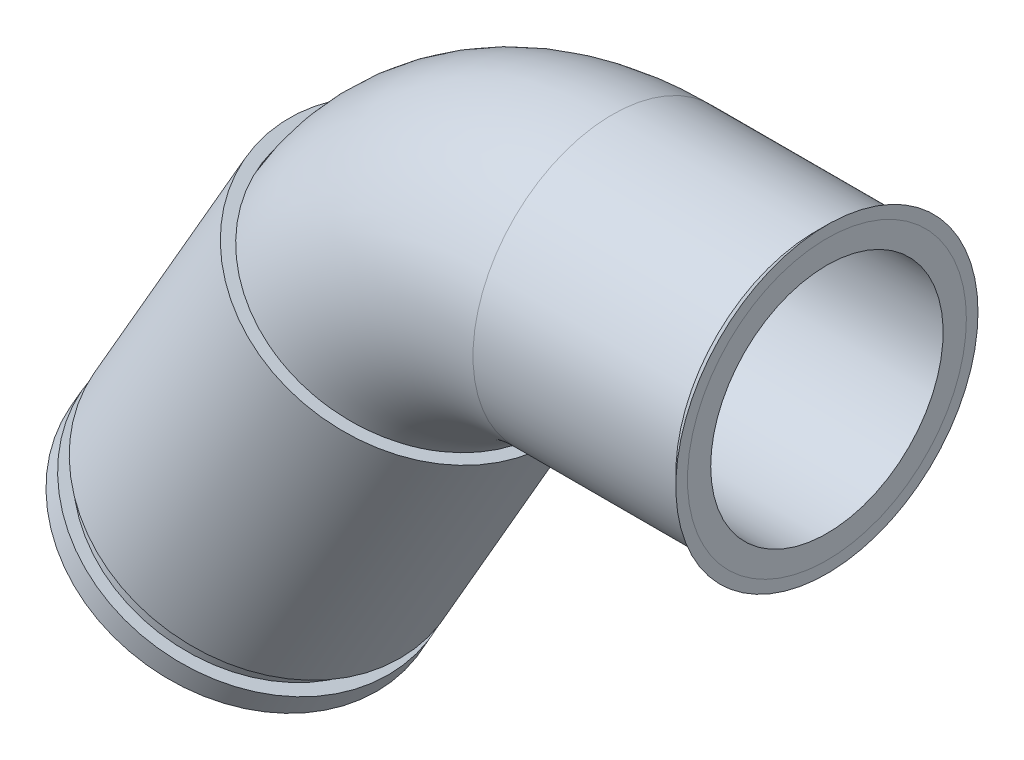
ISO-10303-21;
HEADER;
FILE_DESCRIPTION(('STEP AP214'),'2;1');
FILE_NAME('part.step','',(''),(''),'','','');
FILE_SCHEMA(('AUTOMOTIVE_DESIGN { 1 0 10303 214 1 1 1 1 }'));
ENDSEC;
DATA;
#1=APPLICATION_CONTEXT('core data for automotive mechanical design processes');
#2=APPLICATION_PROTOCOL_DEFINITION('international standard','automotive_design',2000,#1);
#3=PRODUCT_CONTEXT('',#1,'mechanical');
#4=PRODUCT('Part','Part','',(#3));
#5=PRODUCT_RELATED_PRODUCT_CATEGORY('part','',(#4));
#6=PRODUCT_DEFINITION_FORMATION('','',#4);
#7=PRODUCT_DEFINITION_CONTEXT('part definition',#1,'design');
#8=PRODUCT_DEFINITION('design','',#6,#7);
#9=PRODUCT_DEFINITION_SHAPE('','',#8);
#10=(LENGTH_UNIT() NAMED_UNIT(*) SI_UNIT(.MILLI.,.METRE.));
#11=(NAMED_UNIT(*) PLANE_ANGLE_UNIT() SI_UNIT($,.RADIAN.));
#12=(NAMED_UNIT(*) SI_UNIT($,.STERADIAN.) SOLID_ANGLE_UNIT());
#13=UNCERTAINTY_MEASURE_WITH_UNIT(LENGTH_MEASURE(1.E-05),#10,'distance_accuracy_value','');
#14=(GEOMETRIC_REPRESENTATION_CONTEXT(3) GLOBAL_UNCERTAINTY_ASSIGNED_CONTEXT((#13)) GLOBAL_UNIT_ASSIGNED_CONTEXT((#10,
#11,#12)) REPRESENTATION_CONTEXT('',''));
#15=CARTESIAN_POINT('',(0.,0.,0.));
#16=DIRECTION('',(0.,0.,1.));
#17=DIRECTION('',(1.,0.,0.));
#18=AXIS2_PLACEMENT_3D('',#15,#16,#17);
#19=CARTESIAN_POINT('',(15.,0.,0.));
#20=DIRECTION('',(1.,0.,0.));
#21=DIRECTION('',(0.,0.,-1.));
#22=AXIS2_PLACEMENT_3D('',#19,#20,#21);
#23=PLANE('',#22);
#24=CARTESIAN_POINT('',(15.,0.,0.));
#25=DIRECTION('',(1.,0.,0.));
#26=DIRECTION('',(0.,0.,-1.));
#27=AXIS2_PLACEMENT_3D('',#24,#25,#26);
#28=CIRCLE('',#27,6.);
#29=CARTESIAN_POINT('',(15.,0.,-6.));
#30=VERTEX_POINT('',#29);
#31=EDGE_CURVE('E79',#30,#30,#28,.T.);
#32=ORIENTED_EDGE('',*,*,#31,.F.);
#33=EDGE_LOOP('',(#32));
#34=FACE_BOUND('',#33,.T.);
#35=CARTESIAN_POINT('',(15.,0.,0.));
#36=DIRECTION('',(1.,0.,0.));
#37=DIRECTION('',(0.,0.,-1.));
#38=AXIS2_PLACEMENT_3D('',#35,#36,#37);
#39=CIRCLE('',#38,6.5);
#40=CARTESIAN_POINT('',(15.,0.,-6.5));
#41=VERTEX_POINT('',#40);
#42=EDGE_CURVE('E75',#41,#41,#39,.T.);
#43=ORIENTED_EDGE('',*,*,#42,.T.);
#44=EDGE_LOOP('',(#43));
#45=FACE_BOUND('',#44,.T.);
#46=ADVANCED_FACE('F67',(#34,#45),#23,.T.);
#47=CARTESIAN_POINT('',(14.,0.,0.));
#48=DIRECTION('',(1.,0.,0.));
#49=DIRECTION('',(0.,0.,-1.));
#50=AXIS2_PLACEMENT_3D('',#47,#48,#49);
#51=CYLINDRICAL_SURFACE('',#50,6.);
#52=CARTESIAN_POINT('',(14.5,0.,0.));
#53=DIRECTION('',(1.,0.,0.));
#54=DIRECTION('',(0.,0.,-1.));
#55=AXIS2_PLACEMENT_3D('',#52,#53,#54);
#56=CIRCLE('',#55,6.);
#57=CARTESIAN_POINT('',(14.5,0.,-6.));
#58=VERTEX_POINT('',#57);
#59=EDGE_CURVE('E12',#58,#58,#56,.F.);
#60=ORIENTED_EDGE('',*,*,#59,.T.);
#61=EDGE_LOOP('',(#60));
#62=FACE_BOUND('',#61,.T.);
#63=ORIENTED_EDGE('',*,*,#31,.T.);
#64=EDGE_LOOP('',(#63));
#65=FACE_BOUND('',#64,.T.);
#66=ADVANCED_FACE('F86',(#62,#65),#51,.F.);
#67=CARTESIAN_POINT('',(15.,0.,0.));
#68=DIRECTION('',(1.,0.,0.));
#69=DIRECTION('',(0.,0.,-1.));
#70=AXIS2_PLACEMENT_3D('',#67,#68,#69);
#71=CONICAL_SURFACE('',#70,6.5,0.785398163397443);
#72=ORIENTED_EDGE('',*,*,#59,.F.);
#73=EDGE_LOOP('',(#72));
#74=FACE_BOUND('',#73,.T.);
#75=ORIENTED_EDGE('',*,*,#42,.F.);
#76=EDGE_LOOP('',(#75));
#77=FACE_BOUND('',#76,.T.);
#78=ADVANCED_FACE('F70',(#74,#77),#71,.T.);
#79=CLOSED_SHELL('',(#46,#66,#78));
#80=MANIFOLD_SOLID_BREP('B2',#79);
#81=CARTESIAN_POINT('',(-2.50000000000003,-4.3301270189222,0.));
#82=DIRECTION('',(-0.500000000000004,-0.866025403784436,0.));
#83=DIRECTION('',(0.866025403784436,-0.500000000000004,0.));
#84=AXIS2_PLACEMENT_3D('',#81,#82,#83);
#85=CYLINDRICAL_SURFACE('',#84,6.5);
#86=CARTESIAN_POINT('',(-2.50000000000003,-4.3301270189222,0.));
#87=DIRECTION('',(-0.500000000000004,-0.866025403784436,0.));
#88=DIRECTION('',(0.866025403784436,-0.500000000000004,0.));
#89=AXIS2_PLACEMENT_3D('',#86,#87,#88);
#90=CIRCLE('',#89,6.5);
#91=CARTESIAN_POINT('',(3.12916512459881,-7.58012701892223,0.));
#92=VERTEX_POINT('',#91);
#93=EDGE_CURVE('E155',#92,#92,#90,.T.);
#94=ORIENTED_EDGE('',*,*,#93,.T.);
#95=EDGE_LOOP('',(#94));
#96=FACE_BOUND('',#95,.T.);
#97=CARTESIAN_POINT('',(-9.00000000000008,-15.5884572681199,0.));
#98=DIRECTION('',(-0.500000000000004,-0.866025403784436,0.));
#99=DIRECTION('',(0.866025403784436,-0.500000000000004,0.));
#100=AXIS2_PLACEMENT_3D('',#97,#98,#99);
#101=CIRCLE('',#100,6.5);
#102=CARTESIAN_POINT('',(-3.37083487540125,-18.8384572681199,0.));
#103=VERTEX_POINT('',#102);
#104=EDGE_CURVE('E162',#103,#103,#101,.T.);
#105=ORIENTED_EDGE('',*,*,#104,.F.);
#106=EDGE_LOOP('',(#105));
#107=FACE_BOUND('',#106,.T.);
#108=ADVANCED_FACE('F117',(#96,#107),#85,.T.);
#109=CARTESIAN_POINT('',(5.77350269189623,-10.,0.));
#110=DIRECTION('',(0.,0.,-1.));
#111=DIRECTION('',(-1.,0.,0.));
#112=AXIS2_PLACEMENT_3D('',#109,#110,#111);
#113=TOROIDAL_SURFACE('',#112,10.,6.);
#114=CARTESIAN_POINT('',(5.77350269189623,0.,0.));
#115=DIRECTION('',(-1.,0.,0.));
#116=DIRECTION('',(0.,-1.,0.));
#117=AXIS2_PLACEMENT_3D('',#114,#115,#116);
#118=CIRCLE('',#117,6.);
#119=CARTESIAN_POINT('',(5.77350269189623,0.,-6.));
#120=VERTEX_POINT('',#119);
#121=EDGE_CURVE('E180',#120,#120,#118,.T.);
#122=ORIENTED_EDGE('',*,*,#121,.T.);
#123=EDGE_LOOP('',(#122));
#124=FACE_BOUND('',#123,.T.);
#125=CARTESIAN_POINT('',(-2.88675134594813,-4.99999999999996,-6.));
#126=CARTESIAN_POINT('',(-2.8631808011482,-4.95917462096695,-5.99999999570752));
#127=CARTESIAN_POINT('',(-2.83946609912723,-4.91843289906037,-6.00000000936942));
#128=CARTESIAN_POINT('',(-2.80188648421198,-4.85439314370545,-5.99999996179683));
#129=CARTESIAN_POINT('',(-2.78811777082677,-4.8310386684738,-5.99999992991882));
#130=CARTESIAN_POINT('',(-2.71903517418746,-4.71440351637093,-5.99999963918576));
#131=CARTESIAN_POINT('',(-2.6630092916258,-4.62154321228815,-5.99999898629731));
#132=CARTESIAN_POINT('',(-2.54090922099794,-4.42283633429401,-5.99999106284579));
#133=CARTESIAN_POINT('',(-2.47459194491508,-4.31713903484471,-5.99998281093962));
#134=CARTESIAN_POINT('',(-2.35681299153588,-4.13325412697252,-5.99994699562532));
#135=CARTESIAN_POINT('',(-2.30577957723011,-4.05479148498118,-5.99992477241994));
#136=CARTESIAN_POINT('',(-2.15099356495191,-3.82040950065842,-5.99982372391699));
#137=CARTESIAN_POINT('',(-2.04559994220693,-3.6655681528269,-5.99971050873934));
#138=CARTESIAN_POINT('',(-1.83055780262435,-3.35887665683654,-5.99928360536966));
#139=CARTESIAN_POINT('',(-1.72090922783883,-3.20702654945769,-5.99896991444647));
#140=CARTESIAN_POINT('',(-1.38449380533269,-2.75440427923701,-5.99751416918022));
#141=CARTESIAN_POINT('',(-1.15140371915382,-2.45829504734502,-5.99585525238656));
#142=CARTESIAN_POINT('',(-0.669521615628209,-1.87908890783363,-5.98954679581689));
#143=CARTESIAN_POINT('',(-0.420725691587182,-1.59599526823846,-5.98489650929841));
#144=CARTESIAN_POINT('',(0.0921013138987495,-1.04242651686981,-5.97041922467504));
#145=CARTESIAN_POINT('',(0.356177964494672,-0.771994012074279,-5.9605759483382));
#146=CARTESIAN_POINT('',(0.897448078039649,-0.245000662273623,-5.93306202036012));
#147=CARTESIAN_POINT('',(1.17464201420304,0.0115596815680788,-5.91539108613862));
#148=CARTESIAN_POINT('',(1.82214771609309,0.582527954135764,-5.86252500931495));
#149=CARTESIAN_POINT('',(2.19627681407395,0.892303646627783,-5.82374759689726));
#150=CARTESIAN_POINT('',(2.96003842407751,1.48833688182889,-5.72065355036783));
#151=CARTESIAN_POINT('',(3.349680280821,1.77457992055313,-5.65632130626715));
#152=CARTESIAN_POINT('',(3.9405303480068,2.18493750405728,-5.53434330632105));
#153=CARTESIAN_POINT('',(4.1380668534126,2.31826038738297,-5.4895740671815));
#154=CARTESIAN_POINT('',(4.53473836870204,2.57874945340555,-5.39033693410184));
#155=CARTESIAN_POINT('',(4.73387308193946,2.70591674918954,-5.33587080200265));
#156=CARTESIAN_POINT('',(5.13253791709789,2.95380714910176,-5.21601039741042));
#157=CARTESIAN_POINT('',(5.3320673073196,3.07453759367987,-5.1506289401241));
#158=CARTESIAN_POINT('',(5.73048853174725,3.30946717691898,-5.0075047967128));
#159=CARTESIAN_POINT('',(5.92938055666491,3.42366848390971,-4.92976624718917));
#160=CARTESIAN_POINT('',(6.27475671097497,3.61710122452249,-4.78193036949276));
#161=CARTESIAN_POINT('',(6.42171412899385,3.69784406698291,-4.71491187241041));
#162=CARTESIAN_POINT('',(6.71367183969133,3.85537769793682,-4.57248279443232));
#163=CARTESIAN_POINT('',(6.85867229941266,3.93216882533643,-4.49707293495479));
#164=CARTESIAN_POINT('',(7.14597880862617,4.08168855700573,-4.3370636774881));
#165=CARTESIAN_POINT('',(7.28828122671474,4.15441191189812,-4.25245280203838));
#166=CARTESIAN_POINT('',(7.56887990156091,4.29542609545569,-4.07340960178174));
#167=CARTESIAN_POINT('',(7.70717611848826,4.36371688005995,-3.97897717937032));
#168=CARTESIAN_POINT('',(7.9799270654506,4.49627256419704,-3.77847146016366));
#169=CARTESIAN_POINT('',(8.11432096312279,4.56048343946674,-3.67227900121301));
#170=CARTESIAN_POINT('',(8.37592458809749,4.68360090558728,-3.44847117353574));
#171=CARTESIAN_POINT('',(8.50313321300806,4.74250668332949,-3.33085405948283));
#172=CARTESIAN_POINT('',(8.74800643071963,4.85433610046445,-3.08396481590837));
#173=CARTESIAN_POINT('',(8.86569223541281,4.90727314480523,-2.95472002467465));
#174=CARTESIAN_POINT('',(9.08931218720724,5.00662282958167,-2.68425635662113));
#175=CARTESIAN_POINT('',(9.19525351670448,5.05303946230233,-2.54304489236943));
#176=CARTESIAN_POINT('',(9.4212800305778,5.15101997258318,-2.20603097601116));
#177=CARTESIAN_POINT('',(9.5366221998311,5.20020280704744,-2.00623568194795));
#178=CARTESIAN_POINT('',(9.68657928675456,5.26351410015877,-1.69356747351673));
#179=CARTESIAN_POINT('',(9.73272971574463,5.28287706975643,-1.58715796385373));
#180=CARTESIAN_POINT('',(9.81657379950277,5.31790245188659,-1.37048733201849));
#181=CARTESIAN_POINT('',(9.85427146725962,5.33356662063082,-1.26022806639371));
#182=CARTESIAN_POINT('',(9.92075109179817,5.36109976188872,-1.03558078211471));
#183=CARTESIAN_POINT('',(9.94945700391468,5.37293639008483,-0.921166224118469));
#184=CARTESIAN_POINT('',(9.9968917676823,5.39245358442439,-0.689982698850797));
#185=CARTESIAN_POINT('',(10.0156252285549,5.40013607061925,-0.573214845207823));
#186=CARTESIAN_POINT('',(10.0426913085208,5.41122506951521,-0.338295698977641));
#187=CARTESIAN_POINT('',(10.0510258694129,5.41463238052549,-0.22014466883305));
#188=CARTESIAN_POINT('',(10.0570967658759,5.41711492803718,0.0164681480921139));
#189=CARTESIAN_POINT('',(10.0548340781555,5.41619056377288,0.134929905228367));
#190=CARTESIAN_POINT('',(10.0405920476822,5.41036361045818,0.358148024058692));
#191=CARTESIAN_POINT('',(10.0297019597393,5.40590696339333,0.462986952545601));
#192=CARTESIAN_POINT('',(9.9997810979836,5.39363462789685,0.671307793526802));
#193=CARTESIAN_POINT('',(9.98074775570132,5.38581787964969,0.774789267242633));
#194=CARTESIAN_POINT('',(9.91191629322292,5.35746544674336,1.0820759227047));
#195=CARTESIAN_POINT('',(9.85037362052202,5.33202233902741,1.28291546991653));
#196=CARTESIAN_POINT('',(9.69830478078817,5.26849603100149,1.67634917604693));
#197=CARTESIAN_POINT('',(9.60714478532791,5.23013567141049,1.86864760458205));
#198=CARTESIAN_POINT('',(9.40142281483809,5.14239440970613,2.23744560904771));
#199=CARTESIAN_POINT('',(9.28684996266602,5.09300838429991,2.41393778669933));
#200=CARTESIAN_POINT('',(8.96789302115184,4.95332213272159,2.84683162407363));
#201=CARTESIAN_POINT('',(8.74974154861622,4.85582200835198,3.09084779043912));
#202=CARTESIAN_POINT('',(8.40040397979887,4.69492483598543,3.4260524320385));
#203=CARTESIAN_POINT('',(8.28005334921238,4.63874507931249,3.53280317579578));
#204=CARTESIAN_POINT('',(8.03342860438971,4.52185687267325,3.73655358651355));
#205=CARTESIAN_POINT('',(7.90715566369847,4.46114931852449,3.83355517346074));
#206=CARTESIAN_POINT('',(7.57927382894373,4.30097397655887,4.06917763584284));
#207=CARTESIAN_POINT('',(7.37445090072554,4.198562311461,4.20132241501005));
#208=CARTESIAN_POINT('',(6.95775247742698,3.98461317243899,4.44563490587916));
#209=CARTESIAN_POINT('',(6.74587300114825,3.87307049336991,4.55779110570232));
#210=CARTESIAN_POINT('',(6.31776973757133,3.64138186240725,4.76441543815151));
#211=CARTESIAN_POINT('',(6.10153945944068,3.52122224542626,4.85885457682488));
#212=CARTESIAN_POINT('',(5.66740802880571,3.27296996713554,5.03187144018533));
#213=CARTESIAN_POINT('',(5.44950706313894,3.14487818188291,5.11045091240243));
#214=CARTESIAN_POINT('',(4.89183206435474,2.80723477880702,5.29379340506297));
#215=CARTESIAN_POINT('',(4.55208741160377,2.59220710464614,5.38860475357297));
#216=CARTESIAN_POINT('',(3.87778170160164,2.14436227511959,5.55093095294934));
#217=CARTESIAN_POINT('',(3.5432237503107,1.91153492078842,5.61843001275973));
#218=CARTESIAN_POINT('',(2.88310095222034,1.42862491057096,5.73175895465574));
#219=CARTESIAN_POINT('',(2.55753576836056,1.17854290264334,5.77758964993978));
#220=CARTESIAN_POINT('',(1.91835415163112,0.661493456596638,5.85257740873373));
#221=CARTESIAN_POINT('',(1.60473364054296,0.394531865932904,5.88174021159729));
#222=CARTESIAN_POINT('',(0.974381166554119,-0.171626616715848,5.92912909970245));
#223=CARTESIAN_POINT('',(0.658466939196105,-0.471792091293618,5.946647527299));
#224=CARTESIAN_POINT('',(0.0450556376082608,-1.09016294056321,5.97254775594362));
#225=CARTESIAN_POINT('',(-0.252460115821277,-1.40834936877978,5.98093897202202));
#226=CARTESIAN_POINT('',(-0.718264364111324,-1.93833806783525,5.99018260252706));
#227=CARTESIAN_POINT('',(-0.892752812695778,-2.14469693418761,5.99268740833277));
#228=CARTESIAN_POINT('',(-1.233558485839,-2.56408040560746,5.9963443814695));
#229=CARTESIAN_POINT('',(-1.39987552218038,-2.7771051640299,5.9974965176576));
#230=CARTESIAN_POINT('',(-1.76331677160183,-3.26216334002851,5.99923392576914));
#231=CARTESIAN_POINT('',(-1.95810493568333,-3.5359557716882,5.99961338704292));
#232=CARTESIAN_POINT('',(-2.25949876502255,-3.98285348291473,5.99991532943456));
#233=CARTESIAN_POINT('',(-2.37053254599455,-4.15299034957409,5.99995914130738));
#234=CARTESIAN_POINT('',(-2.54224900021531,-4.42505845627155,5.9999919403577));
#235=CARTESIAN_POINT('',(-2.60465370662698,-4.52590438577176,5.99999615661617));
#236=CARTESIAN_POINT('',(-2.71658174881341,-4.71042540539442,5.99999981710306));
#237=CARTESIAN_POINT('',(-2.76640054325266,-4.79392129243567,5.99999998412275));
#238=CARTESIAN_POINT('',(-2.8394662413975,-4.9184331145014,5.99999997676377));
#239=CARTESIAN_POINT('',(-2.86318102737894,-4.95917495664017,5.99999993393107));
#240=CARTESIAN_POINT('',(-2.88675134594813,-4.99999999999996,6.));
#241=B_SPLINE_CURVE_WITH_KNOTS('',3,(#125,#126,#127,#128,#129,#130,#131,#132,#133,#134,#135,
#136,#137,#138,#139,#140,#141,#142,#143,#144,#145,#146,#147,#148,#149,#150,#151,#152,#153,#154,
#155,#156,#157,#158,#159,#160,#161,#162,#163,#164,#165,#166,#167,#168,#169,#170,#171,#172,#173,
#174,#175,#176,#177,#178,#179,#180,#181,#182,#183,#184,#185,#186,#187,#188,#189,#190,#191,#192,
#193,#194,#195,#196,#197,#198,#199,#200,#201,#202,#203,#204,#205,#206,#207,#208,#209,#210,#211,
#212,#213,#214,#215,#216,#217,#218,#219,#220,#221,#222,#223,#224,#225,#226,#227,#228,#229,#230,
#231,#232,#233,#234,#235,#236,#237,#238,#239,#240),.UNSPECIFIED.,.F.,.F.,(4,2,2,2,2,2,2,2,2,2,2,
2,2,2,2,2,2,2,2,2,2,2,2,2,2,2,2,2,2,2,2,2,2,2,2,2,2,2,2,2,2,2,2,2,2,2,2,2,2,2,2,2,2,2,2,2,2,4),
(0.,0.141422240118024,0.222755236019832,0.548097299569467,0.922412016091791,1.20320262641167,
1.7650382077456,2.3268814433681,3.45679773821955,4.58699620617544,5.72075869286638,
6.85456211198006,8.31505466126149,9.77644071739481,10.5036773714684,11.2307820275776,
11.9570389490292,12.6830532621906,13.2245614747674,13.7660231689729,14.308168209738,
14.850318638742,15.3985770306722,15.9469193112849,16.494004471285,17.0407531909619,
17.7453061822049,18.0977339725787,18.449994090235,18.8051575561511,19.1601567242922,
19.5150895930924,19.8699897497029,20.1860926030806,20.5022952322683,21.1341297911115,
21.7804908464422,22.4271528736149,23.4455442236174,23.956450307245,24.4672555756953,
25.2591898475315,26.0515787487921,26.8452532927812,27.6388403363035,28.8764756945217,
30.1148255933542,31.3531290140999,32.5910057852449,33.8985300455629,35.2047042671036,
36.0152733219287,36.8258610383673,37.8334432536968,38.4428442930809,38.7986045754795,
39.090280700434,39.231702940552),.UNSPECIFIED.);
#242=CARTESIAN_POINT('',(-2.88675134594813,-4.99999999999996,-6.));
#243=VERTEX_POINT('',#242);
#244=CARTESIAN_POINT('',(-2.4870462861288,-4.33760584911276,-5.9999813556708));
#245=VERTEX_POINT('',#244);
#246=EDGE_CURVE('E65',#243,#245,#241,.T.);
#247=ORIENTED_EDGE('',*,*,#246,.F.);
#248=CARTESIAN_POINT('',(-2.88675134594814,-4.99999999999996,0.));
#249=DIRECTION('',(0.500000000000004,0.866025403784436,0.));
#250=DIRECTION('',(-0.866025403784436,0.500000000000004,0.));
#251=AXIS2_PLACEMENT_3D('',#248,#249,#250);
#252=CIRCLE('',#251,6.);
#253=CARTESIAN_POINT('',(-2.88675134594813,-4.99999999999996,6.));
#254=VERTEX_POINT('',#253);
#255=EDGE_CURVE('E141',#254,#243,#252,.F.);
#256=ORIENTED_EDGE('',*,*,#255,.F.);
#257=CARTESIAN_POINT('',(-2.48704628614764,-4.33760584910188,5.99998135567075));
#258=VERTEX_POINT('',#257);
#259=EDGE_CURVE('E121',#258,#254,#241,.T.);
#260=ORIENTED_EDGE('',*,*,#259,.F.);
#261=CARTESIAN_POINT('',(-2.96032587587188,-4.06435775057264,-5.97381833525068));
#262=CARTESIAN_POINT('',(-2.81387478049616,-4.14891132991093,-5.98962672910317));
#263=CARTESIAN_POINT('',(-2.66686111994539,-4.23378970640446,-5.99828356759506));
#264=CARTESIAN_POINT('',(-2.37267690441,-4.40363704243516,-6.00125476771535));
#265=CARTESIAN_POINT('',(-2.22550631764199,-4.48860602032247,-5.99556523038983));
#266=CARTESIAN_POINT('',(-1.93197100467819,-4.65807871227878,-5.9698751368838));
#267=CARTESIAN_POINT('',(-1.78560714644244,-4.74258192523082,-5.949861392782));
#268=CARTESIAN_POINT('',(-1.49480645612441,-4.91047578206647,-5.89565557523756));
#269=CARTESIAN_POINT('',(-1.35037035194138,-4.99386600569724,-5.86145829431144));
#270=CARTESIAN_POINT('',(-1.06465046797788,-5.1588264576164,-5.77918396228155));
#271=CARTESIAN_POINT('',(-0.923363638088015,-5.24039844688626,-5.73112103096914));
#272=CARTESIAN_POINT('',(-0.644736346203401,-5.40126398885942,-5.62143561639059));
#273=CARTESIAN_POINT('',(-0.507397356430031,-5.48055669157531,-5.55980814696567));
#274=CARTESIAN_POINT('',(-0.237770340603755,-5.63622592174341,-5.42349402671984));
#275=CARTESIAN_POINT('',(-0.105479260943102,-5.71260421219687,-5.34881542847934));
#276=CARTESIAN_POINT('',(0.153260287681947,-5.86198756024555,-5.18687983287972));
#277=CARTESIAN_POINT('',(0.279706575741381,-5.93499135869469,-5.09961818956857));
#278=CARTESIAN_POINT('',(0.526172543978581,-6.07728855180252,-4.9128887451783));
#279=CARTESIAN_POINT('',(0.646172589745141,-6.14657061052862,-4.81338638825628));
#280=CARTESIAN_POINT('',(0.878544812591811,-6.28073077594133,-4.60304366899329));
#281=CARTESIAN_POINT('',(0.990914146246663,-6.34560724097562,-4.49219911837216));
#282=CARTESIAN_POINT('',(1.20714646823074,-6.47044903028063,-4.26001618616172));
#283=CARTESIAN_POINT('',(1.31101180127592,-6.53041570827373,-4.13868071621893));
#284=CARTESIAN_POINT('',(1.50956061754033,-6.64504792079127,-3.88629325614248));
#285=CARTESIAN_POINT('',(1.60424069429359,-6.69971148859167,-3.7552376927451));
#286=CARTESIAN_POINT('',(1.78373868898645,-6.80334470414659,-3.48427813018208));
#287=CARTESIAN_POINT('',(1.86855038099241,-6.85231075735666,-3.34436863009807));
#288=CARTESIAN_POINT('',(2.02763388999038,-6.94415766410027,-3.05670604995029));
#289=CARTESIAN_POINT('',(2.10190177088049,-6.98703624512431,-2.90895006885803));
#290=CARTESIAN_POINT('',(2.239254167208,-7.06633668811784,-2.60672188182986));
#291=CARTESIAN_POINT('',(2.30234340516852,-7.10276127663732,-2.45225254652358));
#292=CARTESIAN_POINT('',(2.4168778384914,-7.16888776254776,-2.13766301094171));
#293=CARTESIAN_POINT('',(2.46831878793505,-7.19858720855642,-1.97754077463091));
#294=CARTESIAN_POINT('',(2.6035600821818,-7.27666880619534,-1.493442199461));
#295=CARTESIAN_POINT('',(2.66973938516264,-7.31487744458611,-1.16251553902482));
#296=CARTESIAN_POINT('',(2.73147434771275,-7.35052014183283,-0.660546118251503));
#297=CARTESIAN_POINT('',(2.74579529660926,-7.35878834553328,-0.492227811877403));
#298=CARTESIAN_POINT('',(2.76187442380248,-7.36807163394662,-0.154772747432565));
#299=CARTESIAN_POINT('',(2.76363246007001,-7.36908663665892,0.0143640198695958));
#300=CARTESIAN_POINT('',(2.75009361838731,-7.3612699827689,0.515243297600427));
#301=CARTESIAN_POINT('',(2.71672279372305,-7.34200332816591,0.846565433883944));
#302=CARTESIAN_POINT('',(2.60234712760162,-7.27596850654196,1.49788000421277));
#303=CARTESIAN_POINT('',(2.52133956317031,-7.22919876741115,1.81787178949276));
#304=CARTESIAN_POINT('',(2.31427781676722,-7.10965161238645,2.43834274162436));
#305=CARTESIAN_POINT('',(2.18815845790588,-7.03683656659783,2.73879292888879));
#306=CARTESIAN_POINT('',(1.89475841414882,-6.86744197235444,3.31156236022432));
#307=CARTESIAN_POINT('',(1.72747470791392,-6.77086067952868,3.58387953733317));
#308=CARTESIAN_POINT('',(1.35330170543467,-6.55483179582379,4.09755729327574));
#309=CARTESIAN_POINT('',(1.14577974863687,-6.43501893820382,4.33830374379561));
#310=CARTESIAN_POINT('',(0.698933550154404,-6.17703216522361,4.77656574223514));
#311=CARTESIAN_POINT('',(0.459608053542049,-6.03885752533052,4.97407958343588));
#312=CARTESIAN_POINT('',(-0.0462903951972732,-5.74677691976826,5.32179680119153));
#313=CARTESIAN_POINT('',(-0.313073756762197,-5.59274947415343,5.47159227913651));
#314=CARTESIAN_POINT('',(-0.864656519392037,-5.27429301766873,5.71726368826728));
#315=CARTESIAN_POINT('',(-1.14945599476008,-5.10986396389993,5.81313939705783));
#316=CARTESIAN_POINT('',(-1.72859516231295,-4.77549780961502,5.94803814717922));
#317=CARTESIAN_POINT('',(-2.02292181795716,-4.60556823574915,5.98713577667805));
#318=CARTESIAN_POINT('',(-2.61307256607295,-4.26484454246204,6.00748407055258));
#319=CARTESIAN_POINT('',(-2.90889663123986,-4.09405043880515,5.98873578595895));
#320=CARTESIAN_POINT('',(-3.49243890086586,-3.75714215235305,5.89401301241876));
#321=CARTESIAN_POINT('',(-3.78018374942185,-3.59101258658132,5.81825736673031));
#322=CARTESIAN_POINT('',(-4.3405099265002,-3.26750811741114,5.61185587339051));
#323=CARTESIAN_POINT('',(-4.61309152056752,-3.11013306070023,5.48121098732433));
#324=CARTESIAN_POINT('',(-5.13441856360462,-2.80914475206692,5.16921691095835));
#325=CARTESIAN_POINT('',(-5.38323857167074,-2.66548845343019,4.98803382128419));
#326=CARTESIAN_POINT('',(-5.8509271481842,-2.39546832788322,4.57990253165909));
#327=CARTESIAN_POINT('',(-6.06979607673201,-2.2691042930689,4.35295488201452));
#328=CARTESIAN_POINT('',(-6.47086954110668,-2.03754442044736,3.86028948235454));
#329=CARTESIAN_POINT('',(-6.65315366085719,-1.93230263484042,3.59465810447405));
#330=CARTESIAN_POINT('',(-6.97645147060674,-1.74564655735309,3.0317763208654));
#331=CARTESIAN_POINT('',(-7.11746552751999,-1.66423205363471,2.73452619627781));
#332=CARTESIAN_POINT('',(-7.35403423881012,-1.5276490444895,2.11733647908683));
#333=CARTESIAN_POINT('',(-7.44964915553954,-1.47244574657723,1.79742761573222));
#334=CARTESIAN_POINT('',(-7.59296559220358,-1.38970196328995,1.14342275888993));
#335=CARTESIAN_POINT('',(-7.64066723607097,-1.36216140636232,0.809326802101013));
#336=CARTESIAN_POINT('',(-7.67527833960464,-1.34217867642021,0.305255179697957));
#337=CARTESIAN_POINT('',(-7.68065586281758,-1.33907396194564,0.136709407394556));
#338=CARTESIAN_POINT('',(-7.67909971458634,-1.33997240454585,-0.200289635263605));
#339=CARTESIAN_POINT('',(-7.67217059322884,-1.34397293462685,-0.368742916781457));
#340=CARTESIAN_POINT('',(-7.64604065201134,-1.35905906322268,-0.704426467631734));
#341=CARTESIAN_POINT('',(-7.62683529777314,-1.37014727966199,-0.871656261959844));
#342=CARTESIAN_POINT('',(-7.57629896070667,-1.39932444747117,-1.2035942889318));
#343=CARTESIAN_POINT('',(-7.54497245334562,-1.41741081492885,-1.36830342896447));
#344=CARTESIAN_POINT('',(-7.47040673345047,-1.46046135338263,-1.69412945351779));
#345=CARTESIAN_POINT('',(-7.42716454940127,-1.48542723998378,-1.85524543113291));
#346=CARTESIAN_POINT('',(-7.32909803024054,-1.54204597121972,-2.17264001947493));
#347=CARTESIAN_POINT('',(-7.27427797182349,-1.5736963467038,-2.32892039203078));
#348=CARTESIAN_POINT('',(-7.15341722158556,-1.64347533338813,-2.63564692438432));
#349=CARTESIAN_POINT('',(-7.08737284450631,-1.68160607227329,-2.78609114802042));
#350=CARTESIAN_POINT('',(-6.94457363659378,-1.76405123340166,-3.07996911007933));
#351=CARTESIAN_POINT('',(-6.86782275741857,-1.808363374154,-3.22340540879953));
#352=CARTESIAN_POINT('',(-6.70408712917655,-1.90289618319547,-3.50239909928324));
#353=CARTESIAN_POINT('',(-6.61709591934201,-1.95312058161057,-3.63795143550488));
#354=CARTESIAN_POINT('',(-6.43357297501289,-2.05907760292146,-3.9000696616818));
#355=CARTESIAN_POINT('',(-6.33704475936212,-2.11480819421183,-4.02663883673003));
#356=CARTESIAN_POINT('',(-6.13504589797276,-2.23143229121098,-4.2700261414662));
#357=CARTESIAN_POINT('',(-6.02956975056675,-2.29232897330892,-4.38683818306722));
#358=CARTESIAN_POINT('',(-5.81051861402509,-2.41879820595755,-4.60975711962198));
#359=CARTESIAN_POINT('',(-5.69694660786788,-2.48436903428481,-4.71586792308156));
#360=CARTESIAN_POINT('',(-5.46226644901081,-2.61986168717441,-4.91686615916087));
#361=CARTESIAN_POINT('',(-5.3411451296306,-2.68979111352318,-5.01173309542566));
#362=CARTESIAN_POINT('',(-5.09246069268779,-2.83336914013538,-5.18932077056808));
#363=CARTESIAN_POINT('',(-4.96489993111241,-2.90701638016896,-5.2720459090749));
#364=CARTESIAN_POINT('',(-4.7043176962193,-3.05746360363053,-5.42474305736871));
#365=CARTESIAN_POINT('',(-4.57130120255282,-3.13426071205554,-5.49472639308207));
#366=CARTESIAN_POINT('',(-4.30069163065664,-3.29049722123509,-5.62152396801052));
#367=CARTESIAN_POINT('',(-4.1630997702876,-3.36993591885746,-5.67834168003973));
#368=CARTESIAN_POINT('',(-3.85079160323172,-3.55024712317729,-5.79045567005947));
#369=CARTESIAN_POINT('',(-3.67508747783371,-3.65168994727356,-5.84211733333319));
#370=CARTESIAN_POINT('',(-3.31998160155845,-3.8567104205319,-5.92407006385048));
#371=CARTESIAN_POINT('',(-3.14057985420065,-3.96028806766202,-5.95436115143386));
#372=CARTESIAN_POINT('',(-2.96032587587188,-4.06435775057264,-5.97381833525068));
#373=B_SPLINE_CURVE_WITH_KNOTS('',3,(#261,#262,#263,#264,#265,#266,#267,#268,#269,#270,#271,
#272,#273,#274,#275,#276,#277,#278,#279,#280,#281,#282,#283,#284,#285,#286,#287,#288,#289,#290,
#291,#292,#293,#294,#295,#296,#297,#298,#299,#300,#301,#302,#303,#304,#305,#306,#307,#308,#309,
#310,#311,#312,#313,#314,#315,#316,#317,#318,#319,#320,#321,#322,#323,#324,#325,#326,#327,#328,
#329,#330,#331,#332,#333,#334,#335,#336,#337,#338,#339,#340,#341,#342,#343,#344,#345,#346,#347,
#348,#349,#350,#351,#352,#353,#354,#355,#356,#357,#358,#359,#360,#361,#362,#363,#364,#365,#366,
#367,#368,#369,#370,#371,#372),.UNSPECIFIED.,.T.,.F.,(4,2,2,2,2,2,2,2,2,2,2,2,2,2,2,2,2,2,2,2,2,
2,2,2,2,2,2,2,2,2,2,2,2,2,2,2,2,2,2,2,2,2,2,2,2,2,2,2,2,2,2,2,2,2,2,4),(0.,0.509349671542695,
1.01883778536221,1.5287955759146,2.03894076336819,2.54856827802892,3.058383439338,
3.56788514680939,4.07757545811163,4.58873916054187,5.10009230393612,5.61130397931916,
6.12270452487207,6.63442598185599,7.1463379696742,7.6580331771299,8.16991460347732,
9.18291128434008,9.68979641780705,10.1966872818214,11.1922029220808,12.1877754727603,
13.1847922615349,14.181882250179,15.196149690281,16.2104571639909,17.2332157667583,
18.2559785879225,19.2773966078695,20.2987960692827,21.3162943976523,22.3337749015719,
23.3479499418492,24.3621127876747,25.374044998342,26.3859682120866,27.3965444280338,
28.4071180300113,28.9126067584705,29.4179086334988,29.9233972559474,30.4286994157503,
30.9341277013306,31.4393696147411,31.9447777348413,32.4499998052303,32.9555423531169,
33.4608990639923,33.9665687790611,34.4720531299882,34.9784451961334,35.4846533136528,
35.9904092527333,36.4960316317996,37.1229466562632,37.7498610840487),.UNSPECIFIED.);
#374=EDGE_CURVE('E137',#245,#258,#373,.T.);
#375=ORIENTED_EDGE('',*,*,#374,.F.);
#376=EDGE_LOOP('',(#247,#256,#260,#375));
#377=FACE_BOUND('',#376,.T.);
#378=ADVANCED_FACE('F146',(#124,#377),#113,.T.);
#379=CARTESIAN_POINT('',(-10.0000000000001,-17.3205080756887,0.));
#380=DIRECTION('',(-0.500000000000004,-0.866025403784436,0.));
#381=DIRECTION('',(0.,0.,1.));
#382=AXIS2_PLACEMENT_3D('',#379,#380,#381);
#383=PLANE('',#382);
#384=CARTESIAN_POINT('',(-10.0000000000001,-17.3205080756887,0.));
#385=DIRECTION('',(-0.500000000000004,-0.866025403784436,0.));
#386=DIRECTION('',(0.,0.,1.));
#387=AXIS2_PLACEMENT_3D('',#384,#385,#386);
#388=CIRCLE('',#387,5.);
#389=CARTESIAN_POINT('',(-10.0000000000001,-17.3205080756887,5.));
#390=VERTEX_POINT('',#389);
#391=EDGE_CURVE('E159',#390,#390,#388,.T.);
#392=ORIENTED_EDGE('',*,*,#391,.F.);
#393=EDGE_LOOP('',(#392));
#394=FACE_BOUND('',#393,.T.);
#395=CARTESIAN_POINT('',(-10.0000000000001,-17.3205080756887,0.));
#396=DIRECTION('',(-0.500000000000004,-0.866025403784436,0.));
#397=DIRECTION('',(0.866025403784436,-0.500000000000004,0.));
#398=AXIS2_PLACEMENT_3D('',#395,#396,#397);
#399=CIRCLE('',#398,6.5);
#400=CARTESIAN_POINT('',(-4.37083487540125,-20.5705080756888,0.));
#401=VERTEX_POINT('',#400);
#402=EDGE_CURVE('E156',#401,#401,#399,.T.);
#403=ORIENTED_EDGE('',*,*,#402,.T.);
#404=EDGE_LOOP('',(#403));
#405=FACE_BOUND('',#404,.T.);
#406=ADVANCED_FACE('F215',(#394,#405),#383,.T.);
#407=CARTESIAN_POINT('',(15.,0.,0.));
#408=DIRECTION('',(-1.,0.,0.));
#409=DIRECTION('',(0.,0.,1.));
#410=AXIS2_PLACEMENT_3D('',#407,#408,#409);
#411=PLANE('',#410);
#412=CARTESIAN_POINT('',(15.,0.,0.));
#413=DIRECTION('',(-1.,0.,0.));
#414=DIRECTION('',(0.,0.,1.));
#415=AXIS2_PLACEMENT_3D('',#412,#413,#414);
#416=CIRCLE('',#415,5.);
#417=CARTESIAN_POINT('',(15.,0.,5.));
#418=VERTEX_POINT('',#417);
#419=EDGE_CURVE('E176',#418,#418,#416,.T.);
#420=ORIENTED_EDGE('',*,*,#419,.T.);
#421=EDGE_LOOP('',(#420));
#422=FACE_BOUND('',#421,.T.);
#423=CARTESIAN_POINT('',(15.,0.,0.));
#424=DIRECTION('',(-1.,0.,0.));
#425=DIRECTION('',(0.,0.,1.));
#426=AXIS2_PLACEMENT_3D('',#423,#424,#425);
#427=CIRCLE('',#426,6.);
#428=CARTESIAN_POINT('',(15.,0.,-6.));
#429=VERTEX_POINT('',#428);
#430=EDGE_CURVE('E153',#429,#429,#427,.T.);
#431=ORIENTED_EDGE('',*,*,#430,.F.);
#432=EDGE_LOOP('',(#431));
#433=FACE_BOUND('',#432,.T.);
#434=ADVANCED_FACE('F216',(#422,#433),#411,.F.);
#435=CARTESIAN_POINT('',(5.77350269189623,0.,0.));
#436=DIRECTION('',(1.,0.,0.));
#437=DIRECTION('',(0.,0.,-1.));
#438=AXIS2_PLACEMENT_3D('',#435,#436,#437);
#439=CYLINDRICAL_SURFACE('',#438,6.);
#440=CARTESIAN_POINT('',(15.,0.,-6.));
#441=CARTESIAN_POINT('',(14.9038906530406,0.,-6.));
#442=CARTESIAN_POINT('',(14.8077813060812,0.,-6.));
#443=CARTESIAN_POINT('',(14.6155626121623,0.,-6.));
#444=CARTESIAN_POINT('',(14.5194532652029,0.,-6.));
#445=CARTESIAN_POINT('',(14.3272345712841,0.,-6.));
#446=CARTESIAN_POINT('',(14.2311252243247,0.,-6.));
#447=CARTESIAN_POINT('',(14.0389065304059,0.,-6.));
#448=CARTESIAN_POINT('',(13.9427971834464,0.,-6.));
#449=CARTESIAN_POINT('',(13.7505784895276,0.,-6.));
#450=CARTESIAN_POINT('',(13.6544691425682,0.,-6.));
#451=CARTESIAN_POINT('',(13.4622504486494,0.,-6.));
#452=CARTESIAN_POINT('',(13.36614110169,0.,-6.));
#453=CARTESIAN_POINT('',(13.1739224077711,0.,-6.));
#454=CARTESIAN_POINT('',(13.0778130608117,0.,-6.));
#455=CARTESIAN_POINT('',(12.8855943668929,0.,-6.));
#456=CARTESIAN_POINT('',(12.7894850199335,0.,-6.));
#457=CARTESIAN_POINT('',(12.5972663260146,0.,-6.));
#458=CARTESIAN_POINT('',(12.5011569790552,0.,-6.));
#459=CARTESIAN_POINT('',(12.3089382851364,0.,-6.));
#460=CARTESIAN_POINT('',(12.212828938177,0.,-6.));
#461=CARTESIAN_POINT('',(12.0206102442582,0.,-6.));
#462=CARTESIAN_POINT('',(11.9245008972987,0.,-6.));
#463=CARTESIAN_POINT('',(11.7322822033799,0.,-6.));
#464=CARTESIAN_POINT('',(11.6361728564205,0.,-6.));
#465=CARTESIAN_POINT('',(11.4439541625017,0.,-6.));
#466=CARTESIAN_POINT('',(11.3478448155423,0.,-6.));
#467=CARTESIAN_POINT('',(11.1556261216234,0.,-6.));
#468=CARTESIAN_POINT('',(11.059516774664,0.,-6.));
#469=CARTESIAN_POINT('',(10.8672980807452,0.,-6.));
#470=CARTESIAN_POINT('',(10.7711887337858,0.,-6.));
#471=CARTESIAN_POINT('',(10.5789700398669,0.,-6.));
#472=CARTESIAN_POINT('',(10.4828606929075,0.,-6.));
#473=CARTESIAN_POINT('',(10.2906419989887,0.,-6.));
#474=CARTESIAN_POINT('',(10.1945326520293,0.,-6.));
#475=CARTESIAN_POINT('',(10.0023139581105,0.,-6.));
#476=CARTESIAN_POINT('',(9.90620461115104,0.,-6.));
#477=CARTESIAN_POINT('',(9.71398591723221,0.,-6.));
#478=CARTESIAN_POINT('',(9.6178765702728,0.,-6.));
#479=CARTESIAN_POINT('',(9.42565787635397,0.,-6.));
#480=CARTESIAN_POINT('',(9.32954852939456,0.,-6.));
#481=CARTESIAN_POINT('',(9.13732983547573,0.,-6.));
#482=CARTESIAN_POINT('',(9.04122048851631,0.,-6.));
#483=CARTESIAN_POINT('',(8.84900179459748,0.,-6.));
#484=CARTESIAN_POINT('',(8.75289244763807,0.,-6.));
#485=CARTESIAN_POINT('',(8.56067375371924,0.,-6.));
#486=CARTESIAN_POINT('',(8.46456440675983,0.,-6.));
#487=CARTESIAN_POINT('',(8.272345712841,0.,-6.));
#488=CARTESIAN_POINT('',(8.17623636588159,0.,-6.));
#489=CARTESIAN_POINT('',(7.98401767196276,0.,-6.));
#490=CARTESIAN_POINT('',(7.88790832500334,0.,-6.));
#491=CARTESIAN_POINT('',(7.69568963108451,0.,-6.));
#492=CARTESIAN_POINT('',(7.5995802841251,0.,-6.));
#493=CARTESIAN_POINT('',(7.40736159020627,0.,-6.));
#494=CARTESIAN_POINT('',(7.31125224324686,0.,-6.));
#495=CARTESIAN_POINT('',(7.11903354932803,0.,-6.));
#496=CARTESIAN_POINT('',(7.02292420236861,0.,-6.));
#497=CARTESIAN_POINT('',(6.83070550844978,0.,-6.));
#498=CARTESIAN_POINT('',(6.73459616149037,0.,-6.));
#499=CARTESIAN_POINT('',(6.54237746757154,0.,-6.));
#500=CARTESIAN_POINT('',(6.44626812061213,0.,-6.));
#501=CARTESIAN_POINT('',(6.2540494266933,0.,-6.));
#502=CARTESIAN_POINT('',(6.15794007973388,0.,-6.));
#503=CARTESIAN_POINT('',(5.96572138581506,0.,-6.));
#504=CARTESIAN_POINT('',(5.86961203885564,0.,-6.));
#505=CARTESIAN_POINT('',(5.77350269189623,0.,-6.));
#506=B_SPLINE_CURVE_WITH_KNOTS('',3,(#440,#441,#442,#443,#444,#445,#446,#447,#448,#449,#450,
#451,#452,#453,#454,#455,#456,#457,#458,#459,#460,#461,#462,#463,#464,#465,#466,#467,#468,#469,
#470,#471,#472,#473,#474,#475,#476,#477,#478,#479,#480,#481,#482,#483,#484,#485,#486,#487,#488,
#489,#490,#491,#492,#493,#494,#495,#496,#497,#498,#499,#500,#501,#502,#503,#504,#505),
.UNSPECIFIED.,.F.,.F.,(4,2,2,2,2,2,2,2,2,2,2,2,2,2,2,2,2,2,2,2,2,2,2,2,2,2,2,2,2,2,2,2,4),(0.,
0.288328040878243,0.576656081756485,0.864984122634728,1.15331216351297,1.44164020439121,
1.72996824526946,2.0182962861477,2.30662432702594,2.59495236790419,2.88328040878243,
3.17160844966067,3.45993649053891,3.74826453141716,4.0365925722954,4.32492061317364,
4.61324865405188,4.90157669493013,5.18990473580837,5.47823277668661,5.76656081756486,
6.0548888584431,6.34321689932134,6.63154494019958,6.91987298107783,7.20820102195607,
7.49652906283431,7.78485710371256,8.0731851445908,8.36151318546904,8.64984122634728,
8.93816926722553,9.22649730810377),.UNSPECIFIED.);
#507=EDGE_CURVE('BSEAM119',#429,#120,#506,.T.);
#508=ORIENTED_EDGE('',*,*,#430,.T.);
#509=ORIENTED_EDGE('',*,*,#121,.F.);
#510=ORIENTED_EDGE('',*,*,#507,.T.);
#511=ORIENTED_EDGE('',*,*,#507,.F.);
#512=EDGE_LOOP('',(#508,#510,#509,#511));
#513=FACE_BOUND('',#512,.T.);
#514=ADVANCED_FACE('F119',(#513),#439,.T.);
#515=CARTESIAN_POINT('',(-10.0000000000001,-17.3205080756887,0.));
#516=DIRECTION('',(0.500000000000004,0.866025403784436,0.));
#517=DIRECTION('',(-0.866025403784436,0.500000000000004,0.));
#518=AXIS2_PLACEMENT_3D('',#515,#516,#517);
#519=CYLINDRICAL_SURFACE('',#518,5.);
#520=CARTESIAN_POINT('',(-2.88675134594814,-4.99999999999996,0.));
#521=DIRECTION('',(-0.500000000000004,-0.866025403784436,0.));
#522=DIRECTION('',(0.,0.,1.));
#523=AXIS2_PLACEMENT_3D('',#520,#521,#522);
#524=CIRCLE('',#523,5.);
#525=CARTESIAN_POINT('',(-7.21687836487032,-2.49999999999994,0.));
#526=VERTEX_POINT('',#525);
#527=EDGE_CURVE('E170',#526,#526,#524,.T.);
#528=ORIENTED_EDGE('',*,*,#527,.F.);
#529=EDGE_LOOP('',(#528));
#530=FACE_BOUND('',#529,.T.);
#531=ORIENTED_EDGE('',*,*,#391,.T.);
#532=EDGE_LOOP('',(#531));
#533=FACE_BOUND('',#532,.T.);
#534=ADVANCED_FACE('F204',(#530,#533),#519,.F.);
#535=CARTESIAN_POINT('',(5.77350269189623,-10.,0.));
#536=DIRECTION('',(0.,0.,-1.));
#537=DIRECTION('',(-1.,0.,0.));
#538=AXIS2_PLACEMENT_3D('',#535,#536,#537);
#539=TOROIDAL_SURFACE('',#538,10.,5.);
#540=CARTESIAN_POINT('',(5.77350269189623,0.,0.));
#541=DIRECTION('',(-1.,0.,0.));
#542=DIRECTION('',(0.,0.,1.));
#543=AXIS2_PLACEMENT_3D('',#540,#541,#542);
#544=CIRCLE('',#543,5.);
#545=CARTESIAN_POINT('',(5.77350269189623,5.,0.));
#546=VERTEX_POINT('',#545);
#547=EDGE_CURVE('E173',#546,#546,#544,.T.);
#548=CARTESIAN_POINT('',(5.77350269189623,-10.,0.));
#549=DIRECTION('',(0.,0.,-1.));
#550=DIRECTION('',(-1.,0.,0.));
#551=AXIS2_PLACEMENT_3D('',#548,#549,#550);
#552=CIRCLE('',#551,15.);
#553=EDGE_CURVE('',#526,#546,#552,.T.);
#554=ORIENTED_EDGE('',*,*,#527,.T.);
#555=ORIENTED_EDGE('',*,*,#547,.F.);
#556=ORIENTED_EDGE('',*,*,#553,.T.);
#557=ORIENTED_EDGE('',*,*,#553,.F.);
#558=EDGE_LOOP('',(#554,#556,#555,#557));
#559=FACE_BOUND('',#558,.T.);
#560=ADVANCED_FACE('F207',(#559),#539,.F.);
#561=CARTESIAN_POINT('',(5.77350269189623,0.,0.));
#562=DIRECTION('',(1.,0.,0.));
#563=DIRECTION('',(0.,0.,-1.));
#564=AXIS2_PLACEMENT_3D('',#561,#562,#563);
#565=CYLINDRICAL_SURFACE('',#564,5.);
#566=ORIENTED_EDGE('',*,*,#419,.F.);
#567=EDGE_LOOP('',(#566));
#568=FACE_BOUND('',#567,.T.);
#569=ORIENTED_EDGE('',*,*,#547,.T.);
#570=EDGE_LOOP('',(#569));
#571=FACE_BOUND('',#570,.T.);
#572=ADVANCED_FACE('F203',(#568,#571),#565,.F.);
#573=CARTESIAN_POINT('',(-2.50000000000003,-4.3301270189222,0.));
#574=DIRECTION('',(-0.500000000000004,-0.866025403784436,0.));
#575=DIRECTION('',(0.866025403784436,-0.500000000000004,0.));
#576=AXIS2_PLACEMENT_3D('',#573,#574,#575);
#577=CYLINDRICAL_SURFACE('',#576,6.);
#578=ORIENTED_EDGE('',*,*,#255,.T.);
#579=ORIENTED_EDGE('',*,*,#246,.T.);
#580=CARTESIAN_POINT('',(-2.50000000000003,-4.3301270189222,0.));
#581=DIRECTION('',(-0.500000000000004,-0.866025403784436,0.));
#582=DIRECTION('',(0.866025403784436,-0.500000000000004,0.));
#583=AXIS2_PLACEMENT_3D('',#580,#581,#582);
#584=CIRCLE('',#583,6.);
#585=EDGE_CURVE('E152',#258,#245,#584,.T.);
#586=ORIENTED_EDGE('',*,*,#585,.F.);
#587=ORIENTED_EDGE('',*,*,#259,.T.);
#588=EDGE_LOOP('',(#578,#579,#586,#587));
#589=FACE_BOUND('',#588,.T.);
#590=ADVANCED_FACE('F154',(#589),#577,.F.);
#591=CARTESIAN_POINT('',(-2.50000000000003,-4.3301270189222,0.));
#592=DIRECTION('',(-0.500000000000004,-0.866025403784436,0.));
#593=DIRECTION('',(0.866025403784436,-0.500000000000004,0.));
#594=AXIS2_PLACEMENT_3D('',#591,#592,#593);
#595=PLANE('',#594);
#596=ORIENTED_EDGE('',*,*,#93,.F.);
#597=EDGE_LOOP('',(#596));
#598=FACE_BOUND('',#597,.T.);
#599=ORIENTED_EDGE('',*,*,#585,.T.);
#600=ORIENTED_EDGE('',*,*,#374,.T.);
#601=EDGE_LOOP('',(#599,#600));
#602=FACE_BOUND('',#601,.T.);
#603=ADVANCED_FACE('F151',(#598,#602),#595,.F.);
#604=CARTESIAN_POINT('',(-9.50000000000009,-16.4544826719043,0.));
#605=DIRECTION('',(-0.500000000000004,-0.866025403784436,0.));
#606=DIRECTION('',(0.866025403784436,-0.500000000000004,0.));
#607=AXIS2_PLACEMENT_3D('',#604,#605,#606);
#608=CIRCLE('',#607,6.5);
#609=CARTESIAN_POINT('',(-3.87083487540125,-19.7044826719043,0.));
#610=VERTEX_POINT('',#609);
#611=EDGE_CURVE('E165',#610,#610,#608,.T.);
#612=ORIENTED_EDGE('',*,*,#611,.T.);
#613=EDGE_LOOP('',(#612));
#614=FACE_BOUND('',#613,.T.);
#615=ORIENTED_EDGE('',*,*,#402,.F.);
#616=EDGE_LOOP('',(#615));
#617=FACE_BOUND('',#616,.T.);
#618=ADVANCED_FACE('F194',(#614,#617),#85,.T.);
#619=CARTESIAN_POINT('',(-9.00000000000008,-15.5884572681199,0.));
#620=DIRECTION('',(-0.500000000000004,-0.866025403784436,0.));
#621=DIRECTION('',(0.866025403784436,-0.500000000000004,0.));
#622=AXIS2_PLACEMENT_3D('',#619,#620,#621);
#623=CYLINDRICAL_SURFACE('',#622,6.);
#624=CARTESIAN_POINT('',(-9.00000000000008,-15.5884572681199,0.));
#625=DIRECTION('',(-0.500000000000004,-0.866025403784436,0.));
#626=DIRECTION('',(0.866025403784436,-0.500000000000004,0.));
#627=AXIS2_PLACEMENT_3D('',#624,#625,#626);
#628=CIRCLE('',#627,6.);
#629=CARTESIAN_POINT('',(-3.80384757729346,-18.5884572681199,0.));
#630=VERTEX_POINT('',#629);
#631=EDGE_CURVE('E236',#630,#630,#628,.T.);
#632=ORIENTED_EDGE('',*,*,#631,.T.);
#633=EDGE_LOOP('',(#632));
#634=FACE_BOUND('',#633,.T.);
#635=CARTESIAN_POINT('',(-9.50000000000009,-16.4544826719043,0.));
#636=DIRECTION('',(-0.500000000000004,-0.866025403784436,0.));
#637=DIRECTION('',(0.866025403784436,-0.500000000000004,0.));
#638=AXIS2_PLACEMENT_3D('',#635,#636,#637);
#639=CIRCLE('',#638,6.);
#640=CARTESIAN_POINT('',(-4.30384757729347,-19.4544826719043,0.));
#641=VERTEX_POINT('',#640);
#642=EDGE_CURVE('E240',#641,#641,#639,.T.);
#643=ORIENTED_EDGE('',*,*,#642,.F.);
#644=EDGE_LOOP('',(#643));
#645=FACE_BOUND('',#644,.T.);
#646=ADVANCED_FACE('F196',(#634,#645),#623,.T.);
#647=CARTESIAN_POINT('',(-9.00000000000008,-15.5884572681199,0.));
#648=DIRECTION('',(-0.500000000000004,-0.866025403784436,0.));
#649=DIRECTION('',(0.866025403784436,-0.500000000000004,0.));
#650=AXIS2_PLACEMENT_3D('',#647,#648,#649);
#651=PLANE('',#650);
#652=ORIENTED_EDGE('',*,*,#631,.F.);
#653=EDGE_LOOP('',(#652));
#654=FACE_BOUND('',#653,.T.);
#655=ORIENTED_EDGE('',*,*,#104,.T.);
#656=EDGE_LOOP('',(#655));
#657=FACE_BOUND('',#656,.T.);
#658=ADVANCED_FACE('F250',(#654,#657),#651,.T.);
#659=CARTESIAN_POINT('',(-9.50000000000009,-16.4544826719043,0.));
#660=DIRECTION('',(-0.500000000000004,-0.866025403784436,0.));
#661=DIRECTION('',(0.866025403784436,-0.500000000000004,0.));
#662=AXIS2_PLACEMENT_3D('',#659,#660,#661);
#663=PLANE('',#662);
#664=ORIENTED_EDGE('',*,*,#642,.T.);
#665=EDGE_LOOP('',(#664));
#666=FACE_BOUND('',#665,.T.);
#667=ORIENTED_EDGE('',*,*,#611,.F.);
#668=EDGE_LOOP('',(#667));
#669=FACE_BOUND('',#668,.T.);
#670=ADVANCED_FACE('F248',(#666,#669),#663,.F.);
#671=CLOSED_SHELL('',(#108,#378,#406,#434,#514,#534,#560,#572,#590,#603,#618,#646,#658,#670));
#672=MANIFOLD_SOLID_BREP('B7',#671);
#673=ADVANCED_BREP_SHAPE_REPRESENTATION('',(#18,#80,#672),#14);
#674=SHAPE_DEFINITION_REPRESENTATION(#9,#673);
ENDSEC;
END-ISO-10303-21;
